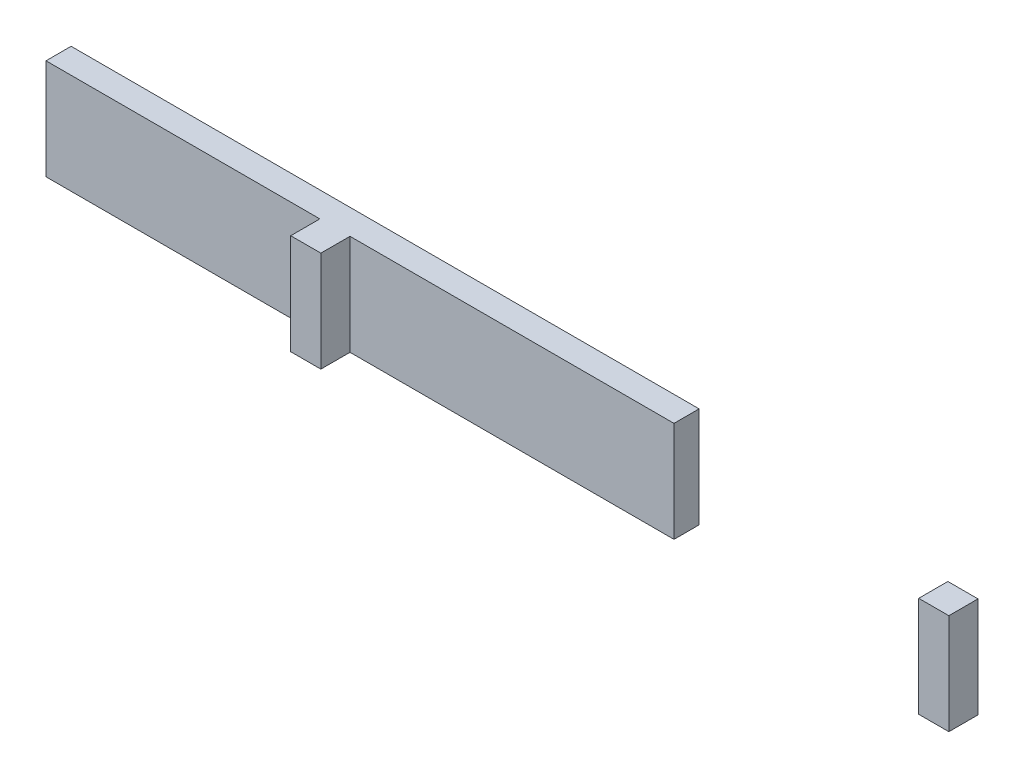
ISO-10303-21;
HEADER;
FILE_DESCRIPTION(('STEP AP214'),'2;1');
FILE_NAME('part.step','',(''),(''),'','','');
FILE_SCHEMA(('AUTOMOTIVE_DESIGN { 1 0 10303 214 1 1 1 1 }'));
ENDSEC;
DATA;
#1=APPLICATION_CONTEXT('core data for automotive mechanical design processes');
#2=APPLICATION_PROTOCOL_DEFINITION('international standard','automotive_design',2000,#1);
#3=PRODUCT_CONTEXT('',#1,'mechanical');
#4=PRODUCT('Part','Part','',(#3));
#5=PRODUCT_RELATED_PRODUCT_CATEGORY('part','',(#4));
#6=PRODUCT_DEFINITION_FORMATION('','',#4);
#7=PRODUCT_DEFINITION_CONTEXT('part definition',#1,'design');
#8=PRODUCT_DEFINITION('design','',#6,#7);
#9=PRODUCT_DEFINITION_SHAPE('','',#8);
#10=(LENGTH_UNIT() NAMED_UNIT(*) SI_UNIT(.MILLI.,.METRE.));
#11=(NAMED_UNIT(*) PLANE_ANGLE_UNIT() SI_UNIT($,.RADIAN.));
#12=(NAMED_UNIT(*) SI_UNIT($,.STERADIAN.) SOLID_ANGLE_UNIT());
#13=UNCERTAINTY_MEASURE_WITH_UNIT(LENGTH_MEASURE(1.E-05),#10,'distance_accuracy_value','');
#14=(GEOMETRIC_REPRESENTATION_CONTEXT(3) GLOBAL_UNCERTAINTY_ASSIGNED_CONTEXT((#13)) GLOBAL_UNIT_ASSIGNED_CONTEXT((#10,
#11,#12)) REPRESENTATION_CONTEXT('',''));
#15=CARTESIAN_POINT('',(0.,0.,0.));
#16=DIRECTION('',(0.,0.,1.));
#17=DIRECTION('',(1.,0.,0.));
#18=AXIS2_PLACEMENT_3D('',#15,#16,#17);
#19=CARTESIAN_POINT('',(359.02,40.,21.6));
#20=DIRECTION('',(1.,0.,0.));
#21=DIRECTION('',(0.,0.,-1.));
#22=AXIS2_PLACEMENT_3D('',#19,#20,#21);
#23=PLANE('',#22);
#24=DIRECTION('',(0.,-1.,0.));
#25=VECTOR('',#24,1.);
#26=CARTESIAN_POINT('',(359.02,40.,10.));
#27=LINE('',#26,#25);
#28=CARTESIAN_POINT('',(359.02,40.,10.));
#29=VERTEX_POINT('',#28);
#30=CARTESIAN_POINT('',(359.02,0.,10.));
#31=VERTEX_POINT('',#30);
#32=EDGE_CURVE('E12',#29,#31,#27,.T.);
#33=ORIENTED_EDGE('',*,*,#32,.T.);
#34=DIRECTION('',(0.,0.,-1.));
#35=VECTOR('',#34,1.);
#36=CARTESIAN_POINT('',(359.02,0.,21.6));
#37=LINE('',#36,#35);
#38=CARTESIAN_POINT('',(359.02,0.,21.6));
#39=VERTEX_POINT('',#38);
#40=EDGE_CURVE('E119',#39,#31,#37,.T.);
#41=ORIENTED_EDGE('',*,*,#40,.F.);
#42=DIRECTION('',(0.,-1.,0.));
#43=VECTOR('',#42,1.);
#44=CARTESIAN_POINT('',(359.02,40.,21.6));
#45=LINE('',#44,#43);
#46=CARTESIAN_POINT('',(359.02,40.,21.6));
#47=VERTEX_POINT('',#46);
#48=EDGE_CURVE('E52',#47,#39,#45,.T.);
#49=ORIENTED_EDGE('',*,*,#48,.F.);
#50=DIRECTION('',(0.,0.,-1.));
#51=VECTOR('',#50,1.);
#52=CARTESIAN_POINT('',(359.02,40.,21.6));
#53=LINE('',#52,#51);
#54=EDGE_CURVE('E107',#47,#29,#53,.T.);
#55=ORIENTED_EDGE('',*,*,#54,.T.);
#56=EDGE_LOOP('',(#33,#41,#49,#55));
#57=FACE_BOUND('',#56,.T.);
#58=ADVANCED_FACE('F47',(#57),#23,.F.);
#59=CARTESIAN_POINT('',(359.02,0.,21.6));
#60=DIRECTION('',(0.,1.,0.));
#61=DIRECTION('',(0.,0.,1.));
#62=AXIS2_PLACEMENT_3D('',#59,#60,#61);
#63=PLANE('',#62);
#64=DIRECTION('',(1.,0.,0.));
#65=VECTOR('',#64,1.);
#66=CARTESIAN_POINT('',(359.02,0.,10.));
#67=LINE('',#66,#65);
#68=CARTESIAN_POINT('',(371.02,0.,10.));
#69=VERTEX_POINT('',#68);
#70=EDGE_CURVE('E56',#31,#69,#67,.T.);
#71=ORIENTED_EDGE('',*,*,#70,.T.);
#72=DIRECTION('',(0.,0.,-1.));
#73=VECTOR('',#72,1.);
#74=CARTESIAN_POINT('',(371.02,0.,21.6));
#75=LINE('',#74,#73);
#76=CARTESIAN_POINT('',(371.02,0.,21.6));
#77=VERTEX_POINT('',#76);
#78=EDGE_CURVE('E102',#77,#69,#75,.T.);
#79=ORIENTED_EDGE('',*,*,#78,.F.);
#80=DIRECTION('',(1.,0.,0.));
#81=VECTOR('',#80,1.);
#82=CARTESIAN_POINT('',(359.02,0.,21.6));
#83=LINE('',#82,#81);
#84=EDGE_CURVE('E84',#39,#77,#83,.T.);
#85=ORIENTED_EDGE('',*,*,#84,.F.);
#86=ORIENTED_EDGE('',*,*,#40,.T.);
#87=EDGE_LOOP('',(#71,#79,#85,#86));
#88=FACE_BOUND('',#87,.T.);
#89=ADVANCED_FACE('F124',(#88),#63,.F.);
#90=CARTESIAN_POINT('',(371.02,40.,21.6));
#91=DIRECTION('',(-1.,0.,0.));
#92=DIRECTION('',(0.,0.,1.));
#93=AXIS2_PLACEMENT_3D('',#90,#91,#92);
#94=PLANE('',#93);
#95=DIRECTION('',(0.,1.,0.));
#96=VECTOR('',#95,1.);
#97=CARTESIAN_POINT('',(371.02,40.,10.));
#98=LINE('',#97,#96);
#99=CARTESIAN_POINT('',(371.02,40.,10.));
#100=VERTEX_POINT('',#99);
#101=EDGE_CURVE('E97',#69,#100,#98,.T.);
#102=ORIENTED_EDGE('',*,*,#101,.T.);
#103=DIRECTION('',(0.,0.,-1.));
#104=VECTOR('',#103,1.);
#105=CARTESIAN_POINT('',(371.02,40.,21.6));
#106=LINE('',#105,#104);
#107=CARTESIAN_POINT('',(371.02,40.,21.6));
#108=VERTEX_POINT('',#107);
#109=EDGE_CURVE('E105',#108,#100,#106,.T.);
#110=ORIENTED_EDGE('',*,*,#109,.F.);
#111=DIRECTION('',(0.,1.,0.));
#112=VECTOR('',#111,1.);
#113=CARTESIAN_POINT('',(371.02,40.,21.6));
#114=LINE('',#113,#112);
#115=EDGE_CURVE('E116',#77,#108,#114,.T.);
#116=ORIENTED_EDGE('',*,*,#115,.F.);
#117=ORIENTED_EDGE('',*,*,#78,.T.);
#118=EDGE_LOOP('',(#102,#110,#116,#117));
#119=FACE_BOUND('',#118,.T.);
#120=ADVANCED_FACE('F99',(#119),#94,.F.);
#121=CARTESIAN_POINT('',(359.02,40.,21.6));
#122=DIRECTION('',(0.,-1.,0.));
#123=DIRECTION('',(0.,0.,-1.));
#124=AXIS2_PLACEMENT_3D('',#121,#122,#123);
#125=PLANE('',#124);
#126=DIRECTION('',(-1.,0.,0.));
#127=VECTOR('',#126,1.);
#128=CARTESIAN_POINT('',(359.02,40.,10.));
#129=LINE('',#128,#127);
#130=EDGE_CURVE('E91',#100,#29,#129,.T.);
#131=ORIENTED_EDGE('',*,*,#130,.T.);
#132=ORIENTED_EDGE('',*,*,#54,.F.);
#133=DIRECTION('',(-1.,0.,0.));
#134=VECTOR('',#133,1.);
#135=CARTESIAN_POINT('',(359.02,40.,21.6));
#136=LINE('',#135,#134);
#137=EDGE_CURVE('E110',#108,#47,#136,.T.);
#138=ORIENTED_EDGE('',*,*,#137,.F.);
#139=ORIENTED_EDGE('',*,*,#109,.T.);
#140=EDGE_LOOP('',(#131,#132,#138,#139));
#141=FACE_BOUND('',#140,.T.);
#142=ADVANCED_FACE('F106',(#141),#125,.F.);
#143=CARTESIAN_POINT('',(0.,0.,21.6));
#144=DIRECTION('',(0.,0.,1.));
#145=DIRECTION('',(1.,0.,0.));
#146=AXIS2_PLACEMENT_3D('',#143,#144,#145);
#147=PLANE('',#146);
#148=ORIENTED_EDGE('',*,*,#48,.T.);
#149=ORIENTED_EDGE('',*,*,#84,.T.);
#150=ORIENTED_EDGE('',*,*,#115,.T.);
#151=ORIENTED_EDGE('',*,*,#137,.T.);
#152=EDGE_LOOP('',(#148,#149,#150,#151));
#153=FACE_BOUND('',#152,.T.);
#154=ADVANCED_FACE('F51',(#153),#147,.T.);
#155=CARTESIAN_POINT('',(0.,0.,10.));
#156=DIRECTION('',(0.,0.,1.));
#157=DIRECTION('',(1.,0.,0.));
#158=AXIS2_PLACEMENT_3D('',#155,#156,#157);
#159=PLANE('',#158);
#160=ORIENTED_EDGE('',*,*,#32,.F.);
#161=ORIENTED_EDGE('',*,*,#130,.F.);
#162=ORIENTED_EDGE('',*,*,#101,.F.);
#163=ORIENTED_EDGE('',*,*,#70,.F.);
#164=EDGE_LOOP('',(#160,#161,#162,#163));
#165=FACE_BOUND('',#164,.T.);
#166=ADVANCED_FACE('F109',(#165),#159,.F.);
#167=CLOSED_SHELL('',(#58,#89,#120,#142,#154,#166));
#168=MANIFOLD_SOLID_BREP('B2',#167);
#169=CARTESIAN_POINT('',(0.,0.,10.));
#170=DIRECTION('',(0.,0.,-1.));
#171=DIRECTION('',(-1.,0.,0.));
#172=AXIS2_PLACEMENT_3D('',#169,#170,#171);
#173=PLANE('',#172);
#174=DIRECTION('',(0.,-1.,0.));
#175=VECTOR('',#174,1.);
#176=CARTESIAN_POINT('',(109.02,40.,10.));
#177=LINE('',#176,#175);
#178=CARTESIAN_POINT('',(109.02,40.,10.));
#179=VERTEX_POINT('',#178);
#180=CARTESIAN_POINT('',(109.02,0.,10.));
#181=VERTEX_POINT('',#180);
#182=EDGE_CURVE('E187',#179,#181,#177,.T.);
#183=ORIENTED_EDGE('',*,*,#182,.F.);
#184=DIRECTION('',(-1.,0.,0.));
#185=VECTOR('',#184,1.);
#186=CARTESIAN_POINT('',(0.,40.,10.));
#187=LINE('',#186,#185);
#188=CARTESIAN_POINT('',(0.,40.,10.));
#189=VERTEX_POINT('',#188);
#190=EDGE_CURVE('E280',#179,#189,#187,.T.);
#191=ORIENTED_EDGE('',*,*,#190,.T.);
#192=DIRECTION('',(0.,-1.,0.));
#193=VECTOR('',#192,1.);
#194=CARTESIAN_POINT('',(0.,0.,10.));
#195=LINE('',#194,#193);
#196=CARTESIAN_POINT('',(0.,0.,10.));
#197=VERTEX_POINT('',#196);
#198=EDGE_CURVE('E268',#189,#197,#195,.T.);
#199=ORIENTED_EDGE('',*,*,#198,.T.);
#200=DIRECTION('',(1.,0.,0.));
#201=VECTOR('',#200,1.);
#202=CARTESIAN_POINT('',(0.,0.,10.));
#203=LINE('',#202,#201);
#204=EDGE_CURVE('E272',#197,#181,#203,.T.);
#205=ORIENTED_EDGE('',*,*,#204,.T.);
#206=EDGE_LOOP('',(#183,#191,#199,#205));
#207=FACE_BOUND('',#206,.T.);
#208=ADVANCED_FACE('F172',(#207),#173,.F.);
#209=DIRECTION('',(0.,1.,0.));
#210=VECTOR('',#209,1.);
#211=CARTESIAN_POINT('',(121.02,40.,10.));
#212=LINE('',#211,#210);
#213=CARTESIAN_POINT('',(121.02,0.,10.));
#214=VERTEX_POINT('',#213);
#215=CARTESIAN_POINT('',(121.02,40.,10.));
#216=VERTEX_POINT('',#215);
#217=EDGE_CURVE('E198',#214,#216,#212,.T.);
#218=ORIENTED_EDGE('',*,*,#217,.F.);
#219=CARTESIAN_POINT('',(250.,0.,10.));
#220=VERTEX_POINT('',#219);
#221=EDGE_CURVE('E271',#214,#220,#203,.T.);
#222=ORIENTED_EDGE('',*,*,#221,.T.);
#223=DIRECTION('',(0.,1.,0.));
#224=VECTOR('',#223,1.);
#225=CARTESIAN_POINT('',(250.,0.,10.));
#226=LINE('',#225,#224);
#227=CARTESIAN_POINT('',(250.,40.,10.));
#228=VERTEX_POINT('',#227);
#229=EDGE_CURVE('E274',#220,#228,#226,.T.);
#230=ORIENTED_EDGE('',*,*,#229,.T.);
#231=EDGE_CURVE('E279',#228,#216,#187,.T.);
#232=ORIENTED_EDGE('',*,*,#231,.T.);
#233=EDGE_LOOP('',(#218,#222,#230,#232));
#234=FACE_BOUND('',#233,.T.);
#235=ADVANCED_FACE('F320',(#234),#173,.F.);
#236=CARTESIAN_POINT('',(0.,0.,10.));
#237=DIRECTION('',(1.,0.,0.));
#238=DIRECTION('',(0.,0.,-1.));
#239=AXIS2_PLACEMENT_3D('',#236,#237,#238);
#240=PLANE('',#239);
#241=DIRECTION('',(0.,-1.,0.));
#242=VECTOR('',#241,1.);
#243=CARTESIAN_POINT('',(0.,0.,0.));
#244=LINE('',#243,#242);
#245=CARTESIAN_POINT('',(0.,40.,0.));
#246=VERTEX_POINT('',#245);
#247=CARTESIAN_POINT('',(0.,0.,0.));
#248=VERTEX_POINT('',#247);
#249=EDGE_CURVE('E259',#246,#248,#244,.T.);
#250=ORIENTED_EDGE('',*,*,#249,.T.);
#251=DIRECTION('',(0.,0.,-1.));
#252=VECTOR('',#251,1.);
#253=CARTESIAN_POINT('',(0.,0.,10.));
#254=LINE('',#253,#252);
#255=EDGE_CURVE('E50',#197,#248,#254,.T.);
#256=ORIENTED_EDGE('',*,*,#255,.F.);
#257=ORIENTED_EDGE('',*,*,#198,.F.);
#258=DIRECTION('',(0.,0.,-1.));
#259=VECTOR('',#258,1.);
#260=CARTESIAN_POINT('',(0.,40.,10.));
#261=LINE('',#260,#259);
#262=EDGE_CURVE('E276',#189,#246,#261,.T.);
#263=ORIENTED_EDGE('',*,*,#262,.T.);
#264=EDGE_LOOP('',(#250,#256,#257,#263));
#265=FACE_BOUND('',#264,.T.);
#266=ADVANCED_FACE('F174',(#265),#240,.F.);
#267=CARTESIAN_POINT('',(0.,0.,10.));
#268=DIRECTION('',(0.,1.,0.));
#269=DIRECTION('',(0.,0.,1.));
#270=AXIS2_PLACEMENT_3D('',#267,#268,#269);
#271=PLANE('',#270);
#272=DIRECTION('',(1.,0.,0.));
#273=VECTOR('',#272,1.);
#274=CARTESIAN_POINT('',(0.,0.,0.));
#275=LINE('',#274,#273);
#276=CARTESIAN_POINT('',(250.,0.,0.));
#277=VERTEX_POINT('',#276);
#278=EDGE_CURVE('E265',#248,#277,#275,.T.);
#279=ORIENTED_EDGE('',*,*,#278,.T.);
#280=DIRECTION('',(0.,0.,-1.));
#281=VECTOR('',#280,1.);
#282=CARTESIAN_POINT('',(250.,0.,10.));
#283=LINE('',#282,#281);
#284=EDGE_CURVE('E182',#220,#277,#283,.T.);
#285=ORIENTED_EDGE('',*,*,#284,.F.);
#286=ORIENTED_EDGE('',*,*,#221,.F.);
#287=DIRECTION('',(0.,0.,-1.));
#288=VECTOR('',#287,1.);
#289=CARTESIAN_POINT('',(121.02,0.,21.6));
#290=LINE('',#289,#288);
#291=CARTESIAN_POINT('',(121.02,0.,21.6));
#292=VERTEX_POINT('',#291);
#293=EDGE_CURVE('E243',#292,#214,#290,.T.);
#294=ORIENTED_EDGE('',*,*,#293,.F.);
#295=DIRECTION('',(1.,0.,0.));
#296=VECTOR('',#295,1.);
#297=CARTESIAN_POINT('',(109.02,0.,21.6));
#298=LINE('',#297,#296);
#299=CARTESIAN_POINT('',(109.02,0.,21.6));
#300=VERTEX_POINT('',#299);
#301=EDGE_CURVE('E236',#300,#292,#298,.T.);
#302=ORIENTED_EDGE('',*,*,#301,.F.);
#303=DIRECTION('',(0.,0.,-1.));
#304=VECTOR('',#303,1.);
#305=CARTESIAN_POINT('',(109.02,0.,21.6));
#306=LINE('',#305,#304);
#307=EDGE_CURVE('E245',#300,#181,#306,.T.);
#308=ORIENTED_EDGE('',*,*,#307,.T.);
#309=ORIENTED_EDGE('',*,*,#204,.F.);
#310=ORIENTED_EDGE('',*,*,#255,.T.);
#311=EDGE_LOOP('',(#279,#285,#286,#294,#302,#308,#309,#310));
#312=FACE_BOUND('',#311,.T.);
#313=ADVANCED_FACE('F238',(#312),#271,.F.);
#314=CARTESIAN_POINT('',(250.,0.,10.));
#315=DIRECTION('',(-1.,0.,0.));
#316=DIRECTION('',(0.,0.,1.));
#317=AXIS2_PLACEMENT_3D('',#314,#315,#316);
#318=PLANE('',#317);
#319=DIRECTION('',(0.,1.,0.));
#320=VECTOR('',#319,1.);
#321=CARTESIAN_POINT('',(250.,0.,0.));
#322=LINE('',#321,#320);
#323=CARTESIAN_POINT('',(250.,40.,0.));
#324=VERTEX_POINT('',#323);
#325=EDGE_CURVE('E285',#277,#324,#322,.T.);
#326=ORIENTED_EDGE('',*,*,#325,.T.);
#327=DIRECTION('',(0.,0.,-1.));
#328=VECTOR('',#327,1.);
#329=CARTESIAN_POINT('',(250.,40.,10.));
#330=LINE('',#329,#328);
#331=EDGE_CURVE('E287',#228,#324,#330,.T.);
#332=ORIENTED_EDGE('',*,*,#331,.F.);
#333=ORIENTED_EDGE('',*,*,#229,.F.);
#334=ORIENTED_EDGE('',*,*,#284,.T.);
#335=EDGE_LOOP('',(#326,#332,#333,#334));
#336=FACE_BOUND('',#335,.T.);
#337=ADVANCED_FACE('F294',(#336),#318,.F.);
#338=CARTESIAN_POINT('',(0.,40.,10.));
#339=DIRECTION('',(0.,-1.,0.));
#340=DIRECTION('',(0.,0.,-1.));
#341=AXIS2_PLACEMENT_3D('',#338,#339,#340);
#342=PLANE('',#341);
#343=DIRECTION('',(-1.,0.,0.));
#344=VECTOR('',#343,1.);
#345=CARTESIAN_POINT('',(0.,40.,0.));
#346=LINE('',#345,#344);
#347=EDGE_CURVE('E275',#324,#246,#346,.T.);
#348=ORIENTED_EDGE('',*,*,#347,.T.);
#349=ORIENTED_EDGE('',*,*,#262,.F.);
#350=ORIENTED_EDGE('',*,*,#190,.F.);
#351=DIRECTION('',(0.,0.,-1.));
#352=VECTOR('',#351,1.);
#353=CARTESIAN_POINT('',(109.02,40.,21.6));
#354=LINE('',#353,#352);
#355=CARTESIAN_POINT('',(109.02,40.,21.6));
#356=VERTEX_POINT('',#355);
#357=EDGE_CURVE('E307',#356,#179,#354,.T.);
#358=ORIENTED_EDGE('',*,*,#357,.F.);
#359=DIRECTION('',(-1.,0.,0.));
#360=VECTOR('',#359,1.);
#361=CARTESIAN_POINT('',(109.02,40.,21.6));
#362=LINE('',#361,#360);
#363=CARTESIAN_POINT('',(121.02,40.,21.6));
#364=VERTEX_POINT('',#363);
#365=EDGE_CURVE('E251',#364,#356,#362,.T.);
#366=ORIENTED_EDGE('',*,*,#365,.F.);
#367=DIRECTION('',(0.,0.,-1.));
#368=VECTOR('',#367,1.);
#369=CARTESIAN_POINT('',(121.02,40.,21.6));
#370=LINE('',#369,#368);
#371=EDGE_CURVE('E262',#364,#216,#370,.T.);
#372=ORIENTED_EDGE('',*,*,#371,.T.);
#373=ORIENTED_EDGE('',*,*,#231,.F.);
#374=ORIENTED_EDGE('',*,*,#331,.T.);
#375=EDGE_LOOP('',(#348,#349,#350,#358,#366,#372,#373,#374));
#376=FACE_BOUND('',#375,.T.);
#377=ADVANCED_FACE('F302',(#376),#342,.F.);
#378=CARTESIAN_POINT('',(0.,0.,0.));
#379=DIRECTION('',(0.,0.,-1.));
#380=DIRECTION('',(-1.,0.,0.));
#381=AXIS2_PLACEMENT_3D('',#378,#379,#380);
#382=PLANE('',#381);
#383=ORIENTED_EDGE('',*,*,#249,.F.);
#384=ORIENTED_EDGE('',*,*,#347,.F.);
#385=ORIENTED_EDGE('',*,*,#325,.F.);
#386=ORIENTED_EDGE('',*,*,#278,.F.);
#387=EDGE_LOOP('',(#383,#384,#385,#386));
#388=FACE_BOUND('',#387,.T.);
#389=ADVANCED_FACE('F298',(#388),#382,.T.);
#390=CARTESIAN_POINT('',(109.02,40.,21.6));
#391=DIRECTION('',(1.,0.,0.));
#392=DIRECTION('',(0.,1.,0.));
#393=AXIS2_PLACEMENT_3D('',#390,#391,#392);
#394=PLANE('',#393);
#395=ORIENTED_EDGE('',*,*,#182,.T.);
#396=ORIENTED_EDGE('',*,*,#307,.F.);
#397=DIRECTION('',(0.,-1.,0.));
#398=VECTOR('',#397,1.);
#399=CARTESIAN_POINT('',(109.02,40.,21.6));
#400=LINE('',#399,#398);
#401=EDGE_CURVE('E249',#356,#300,#400,.T.);
#402=ORIENTED_EDGE('',*,*,#401,.F.);
#403=ORIENTED_EDGE('',*,*,#357,.T.);
#404=EDGE_LOOP('',(#395,#396,#402,#403));
#405=FACE_BOUND('',#404,.T.);
#406=ADVANCED_FACE('F256',(#405),#394,.F.);
#407=CARTESIAN_POINT('',(121.02,40.,21.6));
#408=DIRECTION('',(-1.,0.,0.));
#409=DIRECTION('',(0.,0.,1.));
#410=AXIS2_PLACEMENT_3D('',#407,#408,#409);
#411=PLANE('',#410);
#412=ORIENTED_EDGE('',*,*,#217,.T.);
#413=ORIENTED_EDGE('',*,*,#371,.F.);
#414=DIRECTION('',(0.,1.,0.));
#415=VECTOR('',#414,1.);
#416=CARTESIAN_POINT('',(121.02,40.,21.6));
#417=LINE('',#416,#415);
#418=EDGE_CURVE('E247',#292,#364,#417,.T.);
#419=ORIENTED_EDGE('',*,*,#418,.F.);
#420=ORIENTED_EDGE('',*,*,#293,.T.);
#421=EDGE_LOOP('',(#412,#413,#419,#420));
#422=FACE_BOUND('',#421,.T.);
#423=ADVANCED_FACE('F316',(#422),#411,.F.);
#424=CARTESIAN_POINT('',(0.,0.,21.6));
#425=DIRECTION('',(0.,0.,1.));
#426=DIRECTION('',(1.,0.,0.));
#427=AXIS2_PLACEMENT_3D('',#424,#425,#426);
#428=PLANE('',#427);
#429=ORIENTED_EDGE('',*,*,#401,.T.);
#430=ORIENTED_EDGE('',*,*,#301,.T.);
#431=ORIENTED_EDGE('',*,*,#418,.T.);
#432=ORIENTED_EDGE('',*,*,#365,.T.);
#433=EDGE_LOOP('',(#429,#430,#431,#432));
#434=FACE_BOUND('',#433,.T.);
#435=ADVANCED_FACE('F253',(#434),#428,.T.);
#436=CLOSED_SHELL('',(#208,#235,#266,#313,#337,#377,#389,#406,#423,#435));
#437=MANIFOLD_SOLID_BREP('B6',#436);
#438=ADVANCED_BREP_SHAPE_REPRESENTATION('',(#18,#168,#437),#14);
#439=SHAPE_DEFINITION_REPRESENTATION(#9,#438);
ENDSEC;
END-ISO-10303-21;
